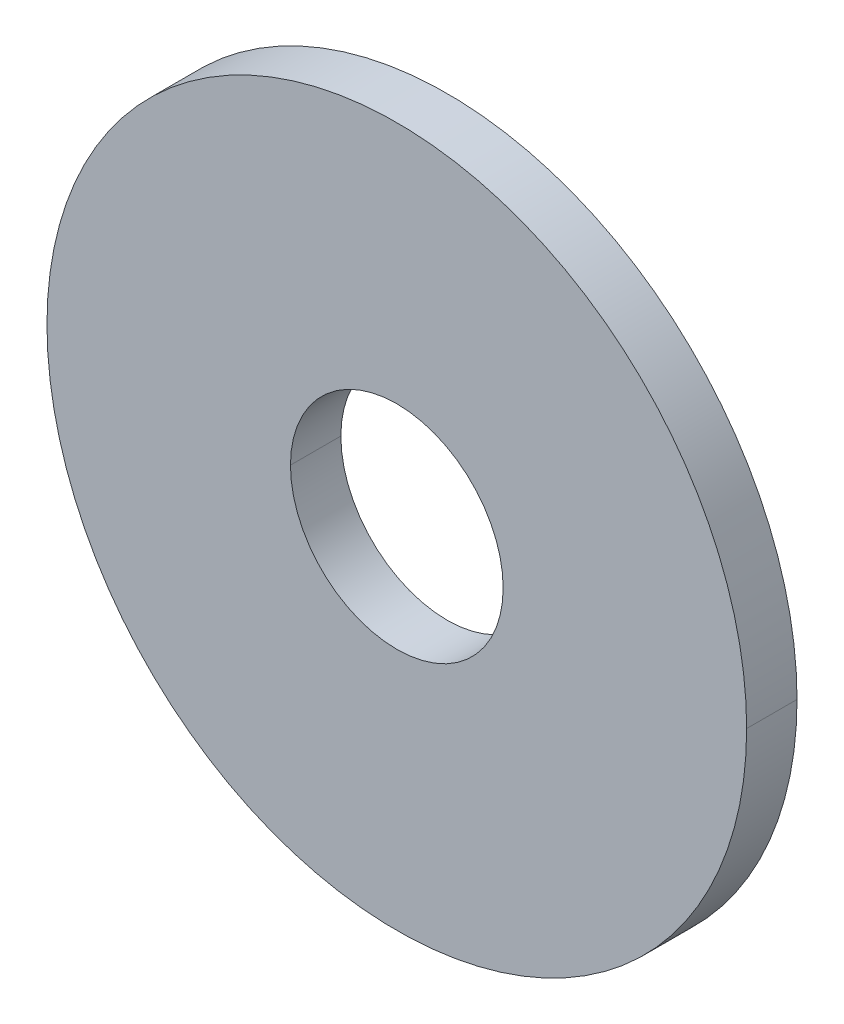
ISO-10303-21;
HEADER;
FILE_DESCRIPTION(('STEP AP214'),'2;1');
FILE_NAME('part.step','',(''),(''),'','','');
FILE_SCHEMA(('AUTOMOTIVE_DESIGN { 1 0 10303 214 1 1 1 1 }'));
ENDSEC;
DATA;
#1=APPLICATION_CONTEXT('core data for automotive mechanical design processes');
#2=APPLICATION_PROTOCOL_DEFINITION('international standard','automotive_design',2000,#1);
#3=PRODUCT_CONTEXT('',#1,'mechanical');
#4=PRODUCT('Part','Part','',(#3));
#5=PRODUCT_RELATED_PRODUCT_CATEGORY('part','',(#4));
#6=PRODUCT_DEFINITION_FORMATION('','',#4);
#7=PRODUCT_DEFINITION_CONTEXT('part definition',#1,'design');
#8=PRODUCT_DEFINITION('design','',#6,#7);
#9=PRODUCT_DEFINITION_SHAPE('','',#8);
#10=(LENGTH_UNIT() NAMED_UNIT(*) SI_UNIT(.MILLI.,.METRE.));
#11=(NAMED_UNIT(*) PLANE_ANGLE_UNIT() SI_UNIT($,.RADIAN.));
#12=(NAMED_UNIT(*) SI_UNIT($,.STERADIAN.) SOLID_ANGLE_UNIT());
#13=UNCERTAINTY_MEASURE_WITH_UNIT(LENGTH_MEASURE(1.E-05),#10,'distance_accuracy_value','');
#14=(GEOMETRIC_REPRESENTATION_CONTEXT(3) GLOBAL_UNCERTAINTY_ASSIGNED_CONTEXT((#13)) GLOBAL_UNIT_ASSIGNED_CONTEXT((#10,
#11,#12)) REPRESENTATION_CONTEXT('',''));
#15=CARTESIAN_POINT('',(0.,0.,0.));
#16=DIRECTION('',(0.,0.,1.));
#17=DIRECTION('',(1.,0.,0.));
#18=AXIS2_PLACEMENT_3D('',#15,#16,#17);
#19=CARTESIAN_POINT('',(0.,0.,0.));
#20=DIRECTION('',(0.,0.,1.));
#21=DIRECTION('',(1.,0.,0.));
#22=AXIS2_PLACEMENT_3D('',#19,#20,#21);
#23=CYLINDRICAL_SURFACE('',#22,3.3782);
#24=DIRECTION('',(0.,0.,1.));
#25=VECTOR('',#24,1.);
#26=CARTESIAN_POINT('',(3.3782,0.,0.));
#27=LINE('',#26,#25);
#28=CARTESIAN_POINT('',(3.3782,0.,0.));
#29=VERTEX_POINT('',#28);
#30=CARTESIAN_POINT('',(3.3782,0.,1.6002));
#31=VERTEX_POINT('',#30);
#32=EDGE_CURVE('E23',#29,#31,#27,.T.);
#33=ORIENTED_EDGE('',*,*,#32,.T.);
#34=CARTESIAN_POINT('',(0.,0.,1.6002));
#35=DIRECTION('',(0.,0.,-1.));
#36=DIRECTION('',(-1.,0.,0.));
#37=AXIS2_PLACEMENT_3D('',#34,#35,#36);
#38=CIRCLE('',#37,3.3782);
#39=CARTESIAN_POINT('',(-3.3782,0.,1.6002));
#40=VERTEX_POINT('',#39);
#41=EDGE_CURVE('E30',#40,#31,#38,.T.);
#42=ORIENTED_EDGE('',*,*,#41,.F.);
#43=DIRECTION('',(0.,0.,1.));
#44=VECTOR('',#43,1.);
#45=CARTESIAN_POINT('',(-3.3782,0.,0.));
#46=LINE('',#45,#44);
#47=CARTESIAN_POINT('',(-3.3782,0.,0.));
#48=VERTEX_POINT('',#47);
#49=EDGE_CURVE('E10',#48,#40,#46,.T.);
#50=ORIENTED_EDGE('',*,*,#49,.F.);
#51=CARTESIAN_POINT('',(0.,0.,0.));
#52=DIRECTION('',(0.,0.,-1.));
#53=DIRECTION('',(-1.,0.,0.));
#54=AXIS2_PLACEMENT_3D('',#51,#52,#53);
#55=CIRCLE('',#54,3.3782);
#56=EDGE_CURVE('E70',#48,#29,#55,.T.);
#57=ORIENTED_EDGE('',*,*,#56,.T.);
#58=EDGE_LOOP('',(#33,#42,#50,#57));
#59=FACE_BOUND('',#58,.T.);
#60=ADVANCED_FACE('F16',(#59),#23,.F.);
#61=CARTESIAN_POINT('',(0.,0.,0.));
#62=DIRECTION('',(0.,0.,1.));
#63=DIRECTION('',(1.,0.,0.));
#64=AXIS2_PLACEMENT_3D('',#61,#62,#63);
#65=CYLINDRICAL_SURFACE('',#64,3.3782);
#66=ORIENTED_EDGE('',*,*,#49,.T.);
#67=CARTESIAN_POINT('',(0.,0.,1.6002));
#68=DIRECTION('',(0.,0.,-1.));
#69=DIRECTION('',(1.,0.,0.));
#70=AXIS2_PLACEMENT_3D('',#67,#68,#69);
#71=CIRCLE('',#70,3.3782);
#72=EDGE_CURVE('E82',#31,#40,#71,.T.);
#73=ORIENTED_EDGE('',*,*,#72,.F.);
#74=ORIENTED_EDGE('',*,*,#32,.F.);
#75=CARTESIAN_POINT('',(0.,0.,0.));
#76=DIRECTION('',(0.,0.,-1.));
#77=DIRECTION('',(1.,0.,0.));
#78=AXIS2_PLACEMENT_3D('',#75,#76,#77);
#79=CIRCLE('',#78,3.3782);
#80=EDGE_CURVE('E64',#29,#48,#79,.T.);
#81=ORIENTED_EDGE('',*,*,#80,.T.);
#82=EDGE_LOOP('',(#66,#73,#74,#81));
#83=FACE_BOUND('',#82,.T.);
#84=ADVANCED_FACE('F89',(#83),#65,.F.);
#85=CARTESIAN_POINT('',(0.,0.,1.6002));
#86=DIRECTION('',(0.,0.,1.));
#87=DIRECTION('',(1.,0.,0.));
#88=AXIS2_PLACEMENT_3D('',#85,#86,#87);
#89=PLANE('',#88);
#90=ORIENTED_EDGE('',*,*,#41,.T.);
#91=ORIENTED_EDGE('',*,*,#72,.T.);
#92=EDGE_LOOP('',(#90,#91));
#93=FACE_BOUND('',#92,.T.);
#94=CARTESIAN_POINT('',(0.,0.,1.6002));
#95=DIRECTION('',(0.,0.,1.));
#96=DIRECTION('',(-1.,0.,0.));
#97=AXIS2_PLACEMENT_3D('',#94,#95,#96);
#98=CIRCLE('',#97,11.1125);
#99=CARTESIAN_POINT('',(-11.1125,0.,1.6002));
#100=VERTEX_POINT('',#99);
#101=CARTESIAN_POINT('',(11.1125,0.,1.6002));
#102=VERTEX_POINT('',#101);
#103=EDGE_CURVE('E79',#100,#102,#98,.T.);
#104=ORIENTED_EDGE('',*,*,#103,.T.);
#105=CARTESIAN_POINT('',(0.,0.,1.6002));
#106=DIRECTION('',(0.,0.,1.));
#107=DIRECTION('',(1.,0.,0.));
#108=AXIS2_PLACEMENT_3D('',#105,#106,#107);
#109=CIRCLE('',#108,11.1125);
#110=EDGE_CURVE('E69',#102,#100,#109,.T.);
#111=ORIENTED_EDGE('',*,*,#110,.T.);
#112=EDGE_LOOP('',(#104,#111));
#113=FACE_BOUND('',#112,.T.);
#114=ADVANCED_FACE('F86',(#93,#113),#89,.T.);
#115=CARTESIAN_POINT('',(0.,0.,0.));
#116=DIRECTION('',(0.,0.,1.));
#117=DIRECTION('',(1.,0.,0.));
#118=AXIS2_PLACEMENT_3D('',#115,#116,#117);
#119=CYLINDRICAL_SURFACE('',#118,11.1125);
#120=DIRECTION('',(0.,0.,1.));
#121=VECTOR('',#120,1.);
#122=CARTESIAN_POINT('',(11.1125,0.,0.));
#123=LINE('',#122,#121);
#124=CARTESIAN_POINT('',(11.1125,0.,0.));
#125=VERTEX_POINT('',#124);
#126=EDGE_CURVE('E57',#125,#102,#123,.T.);
#127=ORIENTED_EDGE('',*,*,#126,.T.);
#128=ORIENTED_EDGE('',*,*,#103,.F.);
#129=DIRECTION('',(0.,0.,1.));
#130=VECTOR('',#129,1.);
#131=CARTESIAN_POINT('',(-11.1125,0.,0.));
#132=LINE('',#131,#130);
#133=CARTESIAN_POINT('',(-11.1125,0.,0.));
#134=VERTEX_POINT('',#133);
#135=EDGE_CURVE('E60',#134,#100,#132,.T.);
#136=ORIENTED_EDGE('',*,*,#135,.F.);
#137=CARTESIAN_POINT('',(0.,0.,0.));
#138=DIRECTION('',(0.,0.,1.));
#139=DIRECTION('',(-1.,0.,0.));
#140=AXIS2_PLACEMENT_3D('',#137,#138,#139);
#141=CIRCLE('',#140,11.1125);
#142=EDGE_CURVE('E53',#134,#125,#141,.T.);
#143=ORIENTED_EDGE('',*,*,#142,.T.);
#144=EDGE_LOOP('',(#127,#128,#136,#143));
#145=FACE_BOUND('',#144,.T.);
#146=ADVANCED_FACE('F55',(#145),#119,.T.);
#147=CARTESIAN_POINT('',(0.,0.,0.));
#148=DIRECTION('',(0.,0.,1.));
#149=DIRECTION('',(1.,0.,0.));
#150=AXIS2_PLACEMENT_3D('',#147,#148,#149);
#151=CYLINDRICAL_SURFACE('',#150,11.1125);
#152=ORIENTED_EDGE('',*,*,#135,.T.);
#153=ORIENTED_EDGE('',*,*,#110,.F.);
#154=ORIENTED_EDGE('',*,*,#126,.F.);
#155=CARTESIAN_POINT('',(0.,0.,0.));
#156=DIRECTION('',(0.,0.,1.));
#157=DIRECTION('',(1.,0.,0.));
#158=AXIS2_PLACEMENT_3D('',#155,#156,#157);
#159=CIRCLE('',#158,11.1125);
#160=EDGE_CURVE('E65',#125,#134,#159,.T.);
#161=ORIENTED_EDGE('',*,*,#160,.T.);
#162=EDGE_LOOP('',(#152,#153,#154,#161));
#163=FACE_BOUND('',#162,.T.);
#164=ADVANCED_FACE('F68',(#163),#151,.T.);
#165=CARTESIAN_POINT('',(0.,0.,0.));
#166=DIRECTION('',(0.,0.,1.));
#167=DIRECTION('',(1.,0.,0.));
#168=AXIS2_PLACEMENT_3D('',#165,#166,#167);
#169=PLANE('',#168);
#170=ORIENTED_EDGE('',*,*,#56,.F.);
#171=ORIENTED_EDGE('',*,*,#80,.F.);
#172=EDGE_LOOP('',(#170,#171));
#173=FACE_BOUND('',#172,.T.);
#174=ORIENTED_EDGE('',*,*,#142,.F.);
#175=ORIENTED_EDGE('',*,*,#160,.F.);
#176=EDGE_LOOP('',(#174,#175));
#177=FACE_BOUND('',#176,.T.);
#178=ADVANCED_FACE('F72',(#173,#177),#169,.F.);
#179=CLOSED_SHELL('',(#60,#84,#114,#146,#164,#178));
#180=MANIFOLD_SOLID_BREP('B1',#179);
#181=ADVANCED_BREP_SHAPE_REPRESENTATION('',(#18,#180),#14);
#182=SHAPE_DEFINITION_REPRESENTATION(#9,#181);
ENDSEC;
END-ISO-10303-21;
